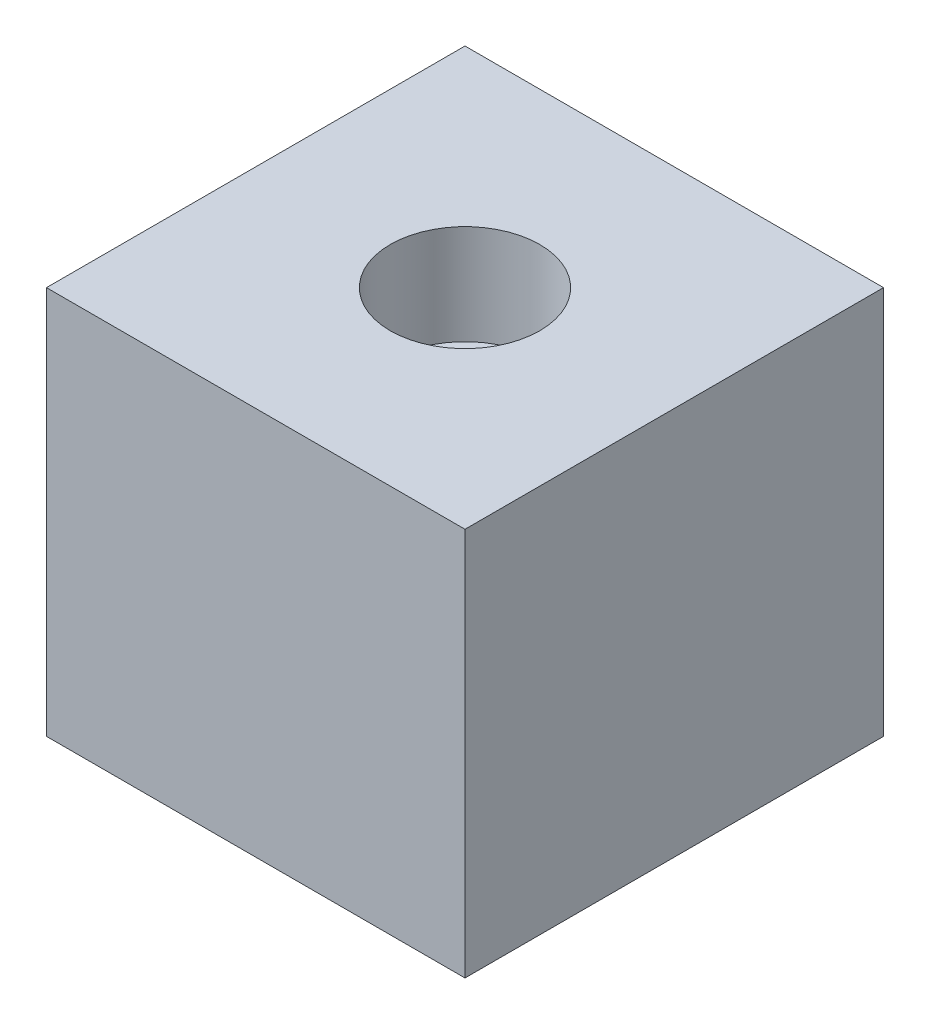
ISO-10303-21;
HEADER;
FILE_DESCRIPTION(('STEP AP214'),'2;1');
FILE_NAME('part.step','',(''),(''),'','','');
FILE_SCHEMA(('AUTOMOTIVE_DESIGN { 1 0 10303 214 1 1 1 1 }'));
ENDSEC;
DATA;
#1=APPLICATION_CONTEXT('core data for automotive mechanical design processes');
#2=APPLICATION_PROTOCOL_DEFINITION('international standard','automotive_design',2000,#1);
#3=PRODUCT_CONTEXT('',#1,'mechanical');
#4=PRODUCT('Part','Part','',(#3));
#5=PRODUCT_RELATED_PRODUCT_CATEGORY('part','',(#4));
#6=PRODUCT_DEFINITION_FORMATION('','',#4);
#7=PRODUCT_DEFINITION_CONTEXT('part definition',#1,'design');
#8=PRODUCT_DEFINITION('design','',#6,#7);
#9=PRODUCT_DEFINITION_SHAPE('','',#8);
#10=(LENGTH_UNIT() NAMED_UNIT(*) SI_UNIT(.MILLI.,.METRE.));
#11=(NAMED_UNIT(*) PLANE_ANGLE_UNIT() SI_UNIT($,.RADIAN.));
#12=(NAMED_UNIT(*) SI_UNIT($,.STERADIAN.) SOLID_ANGLE_UNIT());
#13=UNCERTAINTY_MEASURE_WITH_UNIT(LENGTH_MEASURE(1.E-05),#10,'distance_accuracy_value','');
#14=(GEOMETRIC_REPRESENTATION_CONTEXT(3) GLOBAL_UNCERTAINTY_ASSIGNED_CONTEXT((#13)) GLOBAL_UNIT_ASSIGNED_CONTEXT((#10,
#11,#12)) REPRESENTATION_CONTEXT('',''));
#15=CARTESIAN_POINT('',(0.,0.,0.));
#16=DIRECTION('',(0.,0.,1.));
#17=DIRECTION('',(1.,0.,0.));
#18=AXIS2_PLACEMENT_3D('',#15,#16,#17);
#19=CARTESIAN_POINT('',(21.,39.,21.));
#20=DIRECTION('',(-1.,0.,0.));
#21=DIRECTION('',(0.,0.,1.));
#22=AXIS2_PLACEMENT_3D('',#19,#20,#21);
#23=PLANE('',#22);
#24=DIRECTION('',(0.,0.,-1.));
#25=VECTOR('',#24,1.);
#26=CARTESIAN_POINT('',(21.,0.,21.));
#27=LINE('',#26,#25);
#28=CARTESIAN_POINT('',(21.,0.,21.));
#29=VERTEX_POINT('',#28);
#30=CARTESIAN_POINT('',(21.,0.,-21.));
#31=VERTEX_POINT('',#30);
#32=EDGE_CURVE('E96',#29,#31,#27,.T.);
#33=ORIENTED_EDGE('',*,*,#32,.T.);
#34=DIRECTION('',(0.,-1.,0.));
#35=VECTOR('',#34,1.);
#36=CARTESIAN_POINT('',(21.,39.,-21.));
#37=LINE('',#36,#35);
#38=CARTESIAN_POINT('',(21.,39.,-21.));
#39=VERTEX_POINT('',#38);
#40=EDGE_CURVE('E11',#39,#31,#37,.T.);
#41=ORIENTED_EDGE('',*,*,#40,.F.);
#42=DIRECTION('',(0.,0.,-1.));
#43=VECTOR('',#42,1.);
#44=CARTESIAN_POINT('',(21.,39.,21.));
#45=LINE('',#44,#43);
#46=CARTESIAN_POINT('',(21.,39.,21.));
#47=VERTEX_POINT('',#46);
#48=EDGE_CURVE('E84',#47,#39,#45,.T.);
#49=ORIENTED_EDGE('',*,*,#48,.F.);
#50=DIRECTION('',(0.,-1.,0.));
#51=VECTOR('',#50,1.);
#52=CARTESIAN_POINT('',(21.,39.,21.));
#53=LINE('',#52,#51);
#54=EDGE_CURVE('E92',#47,#29,#53,.T.);
#55=ORIENTED_EDGE('',*,*,#54,.T.);
#56=EDGE_LOOP('',(#33,#41,#49,#55));
#57=FACE_BOUND('',#56,.T.);
#58=ADVANCED_FACE('F33',(#57),#23,.F.);
#59=CARTESIAN_POINT('',(-21.,39.,-21.));
#60=DIRECTION('',(0.,0.,1.));
#61=DIRECTION('',(1.,0.,0.));
#62=AXIS2_PLACEMENT_3D('',#59,#60,#61);
#63=PLANE('',#62);
#64=DIRECTION('',(-1.,0.,0.));
#65=VECTOR('',#64,1.);
#66=CARTESIAN_POINT('',(-21.,0.,-21.));
#67=LINE('',#66,#65);
#68=CARTESIAN_POINT('',(-21.,0.,-21.));
#69=VERTEX_POINT('',#68);
#70=EDGE_CURVE('E88',#31,#69,#67,.T.);
#71=ORIENTED_EDGE('',*,*,#70,.T.);
#72=DIRECTION('',(0.,-1.,0.));
#73=VECTOR('',#72,1.);
#74=CARTESIAN_POINT('',(-21.,39.,-21.));
#75=LINE('',#74,#73);
#76=CARTESIAN_POINT('',(-21.,39.,-21.));
#77=VERTEX_POINT('',#76);
#78=EDGE_CURVE('E41',#77,#69,#75,.T.);
#79=ORIENTED_EDGE('',*,*,#78,.F.);
#80=DIRECTION('',(-1.,0.,0.));
#81=VECTOR('',#80,1.);
#82=CARTESIAN_POINT('',(-21.,39.,-21.));
#83=LINE('',#82,#81);
#84=EDGE_CURVE('E79',#39,#77,#83,.T.);
#85=ORIENTED_EDGE('',*,*,#84,.F.);
#86=ORIENTED_EDGE('',*,*,#40,.T.);
#87=EDGE_LOOP('',(#71,#79,#85,#86));
#88=FACE_BOUND('',#87,.T.);
#89=ADVANCED_FACE('F87',(#88),#63,.F.);
#90=CARTESIAN_POINT('',(-21.,39.,21.));
#91=DIRECTION('',(1.,0.,0.));
#92=DIRECTION('',(0.,0.,-1.));
#93=AXIS2_PLACEMENT_3D('',#90,#91,#92);
#94=PLANE('',#93);
#95=DIRECTION('',(0.,0.,1.));
#96=VECTOR('',#95,1.);
#97=CARTESIAN_POINT('',(-21.,0.,21.));
#98=LINE('',#97,#96);
#99=CARTESIAN_POINT('',(-21.,0.,21.));
#100=VERTEX_POINT('',#99);
#101=EDGE_CURVE('E66',#69,#100,#98,.T.);
#102=ORIENTED_EDGE('',*,*,#101,.T.);
#103=DIRECTION('',(0.,-1.,0.));
#104=VECTOR('',#103,1.);
#105=CARTESIAN_POINT('',(-21.,39.,21.));
#106=LINE('',#105,#104);
#107=CARTESIAN_POINT('',(-21.,39.,21.));
#108=VERTEX_POINT('',#107);
#109=EDGE_CURVE('E89',#108,#100,#106,.T.);
#110=ORIENTED_EDGE('',*,*,#109,.F.);
#111=DIRECTION('',(0.,0.,1.));
#112=VECTOR('',#111,1.);
#113=CARTESIAN_POINT('',(-21.,39.,21.));
#114=LINE('',#113,#112);
#115=EDGE_CURVE('E82',#77,#108,#114,.T.);
#116=ORIENTED_EDGE('',*,*,#115,.F.);
#117=ORIENTED_EDGE('',*,*,#78,.T.);
#118=EDGE_LOOP('',(#102,#110,#116,#117));
#119=FACE_BOUND('',#118,.T.);
#120=ADVANCED_FACE('F90',(#119),#94,.F.);
#121=CARTESIAN_POINT('',(-21.,39.,21.));
#122=DIRECTION('',(0.,0.,-1.));
#123=DIRECTION('',(-1.,0.,0.));
#124=AXIS2_PLACEMENT_3D('',#121,#122,#123);
#125=PLANE('',#124);
#126=DIRECTION('',(1.,0.,0.));
#127=VECTOR('',#126,1.);
#128=CARTESIAN_POINT('',(-21.,0.,21.));
#129=LINE('',#128,#127);
#130=EDGE_CURVE('E72',#100,#29,#129,.T.);
#131=ORIENTED_EDGE('',*,*,#130,.T.);
#132=ORIENTED_EDGE('',*,*,#54,.F.);
#133=DIRECTION('',(1.,0.,0.));
#134=VECTOR('',#133,1.);
#135=CARTESIAN_POINT('',(-21.,39.,21.));
#136=LINE('',#135,#134);
#137=EDGE_CURVE('E49',#108,#47,#136,.T.);
#138=ORIENTED_EDGE('',*,*,#137,.F.);
#139=ORIENTED_EDGE('',*,*,#109,.T.);
#140=EDGE_LOOP('',(#131,#132,#138,#139));
#141=FACE_BOUND('',#140,.T.);
#142=ADVANCED_FACE('F104',(#141),#125,.F.);
#143=CARTESIAN_POINT('',(0.,39.,0.));
#144=DIRECTION('',(0.,-1.,0.));
#145=DIRECTION('',(0.,0.,-1.));
#146=AXIS2_PLACEMENT_3D('',#143,#144,#145);
#147=PLANE('',#146);
#148=CARTESIAN_POINT('',(0.,39.,0.));
#149=DIRECTION('',(0.,1.,0.));
#150=DIRECTION('',(0.,0.,1.));
#151=AXIS2_PLACEMENT_3D('',#148,#149,#150);
#152=CIRCLE('',#151,7.5);
#153=CARTESIAN_POINT('',(0.,39.,7.5));
#154=VERTEX_POINT('',#153);
#155=EDGE_CURVE('E110',#154,#154,#152,.T.);
#156=ORIENTED_EDGE('',*,*,#155,.F.);
#157=EDGE_LOOP('',(#156));
#158=FACE_BOUND('',#157,.T.);
#159=ORIENTED_EDGE('',*,*,#48,.T.);
#160=ORIENTED_EDGE('',*,*,#84,.T.);
#161=ORIENTED_EDGE('',*,*,#115,.T.);
#162=ORIENTED_EDGE('',*,*,#137,.T.);
#163=EDGE_LOOP('',(#159,#160,#161,#162));
#164=FACE_BOUND('',#163,.T.);
#165=ADVANCED_FACE('F80',(#158,#164),#147,.F.);
#166=CARTESIAN_POINT('',(0.,0.,0.));
#167=DIRECTION('',(0.,-1.,0.));
#168=DIRECTION('',(0.,0.,-1.));
#169=AXIS2_PLACEMENT_3D('',#166,#167,#168);
#170=PLANE('',#169);
#171=ORIENTED_EDGE('',*,*,#32,.F.);
#172=ORIENTED_EDGE('',*,*,#130,.F.);
#173=ORIENTED_EDGE('',*,*,#101,.F.);
#174=ORIENTED_EDGE('',*,*,#70,.F.);
#175=EDGE_LOOP('',(#171,#172,#173,#174));
#176=FACE_BOUND('',#175,.T.);
#177=ADVANCED_FACE('F107',(#176),#170,.T.);
#178=CARTESIAN_POINT('',(0.,29.,0.));
#179=DIRECTION('',(0.,1.,0.));
#180=DIRECTION('',(0.,0.,1.));
#181=AXIS2_PLACEMENT_3D('',#178,#179,#180);
#182=CYLINDRICAL_SURFACE('',#181,7.5);
#183=CARTESIAN_POINT('',(0.,29.,0.));
#184=DIRECTION('',(0.,1.,0.));
#185=DIRECTION('',(0.,0.,1.));
#186=AXIS2_PLACEMENT_3D('',#183,#184,#185);
#187=CIRCLE('',#186,7.5);
#188=CARTESIAN_POINT('',(0.,29.,7.5));
#189=VERTEX_POINT('',#188);
#190=EDGE_CURVE('E99',#189,#189,#187,.T.);
#191=ORIENTED_EDGE('',*,*,#190,.F.);
#192=EDGE_LOOP('',(#191));
#193=FACE_BOUND('',#192,.T.);
#194=ORIENTED_EDGE('',*,*,#155,.T.);
#195=EDGE_LOOP('',(#194));
#196=FACE_BOUND('',#195,.T.);
#197=ADVANCED_FACE('F118',(#193,#196),#182,.F.);
#198=CARTESIAN_POINT('',(0.,29.,0.));
#199=DIRECTION('',(0.,1.,0.));
#200=DIRECTION('',(0.,0.,1.));
#201=AXIS2_PLACEMENT_3D('',#198,#199,#200);
#202=PLANE('',#201);
#203=ORIENTED_EDGE('',*,*,#190,.T.);
#204=EDGE_LOOP('',(#203));
#205=FACE_BOUND('',#204,.T.);
#206=ADVANCED_FACE('F116',(#205),#202,.T.);
#207=CLOSED_SHELL('',(#58,#89,#120,#142,#165,#177,#197,#206));
#208=MANIFOLD_SOLID_BREP('B2',#207);
#209=ADVANCED_BREP_SHAPE_REPRESENTATION('',(#18,#208),#14);
#210=SHAPE_DEFINITION_REPRESENTATION(#9,#209);
ENDSEC;
END-ISO-10303-21;
